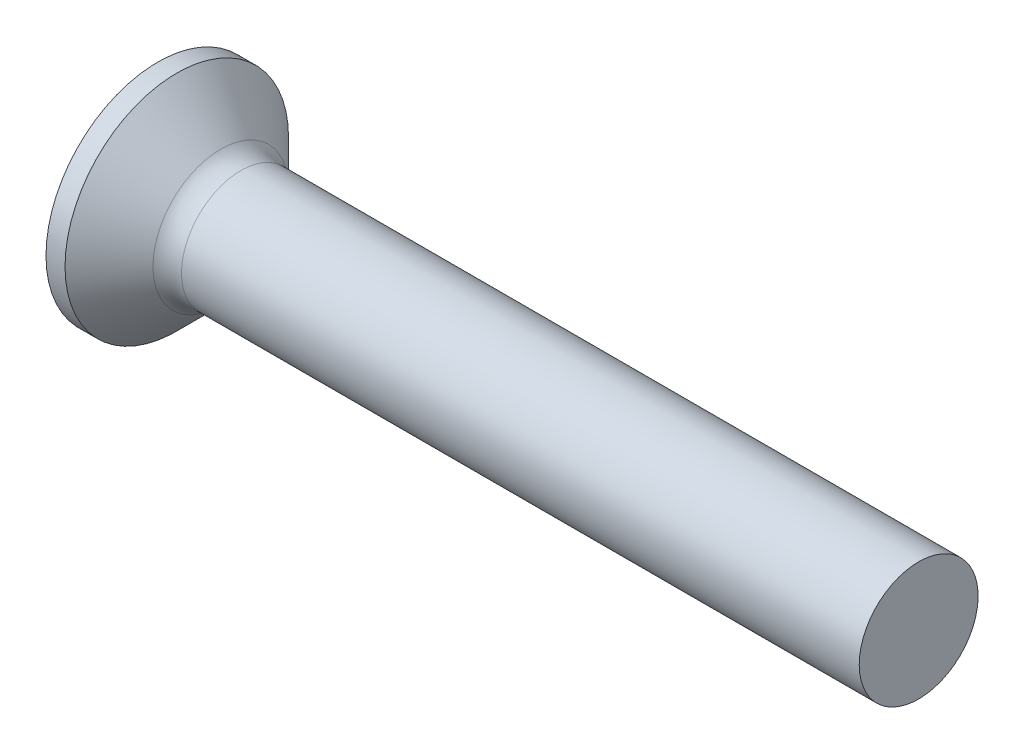
ISO-10303-21;
HEADER;
FILE_DESCRIPTION(('STEP AP214'),'2;1');
FILE_NAME('part.step','',(''),(''),'','','');
FILE_SCHEMA(('AUTOMOTIVE_DESIGN { 1 0 10303 214 1 1 1 1 }'));
ENDSEC;
DATA;
#1=APPLICATION_CONTEXT('core data for automotive mechanical design processes');
#2=APPLICATION_PROTOCOL_DEFINITION('international standard','automotive_design',2000,#1);
#3=PRODUCT_CONTEXT('',#1,'mechanical');
#4=PRODUCT('Part','Part','',(#3));
#5=PRODUCT_RELATED_PRODUCT_CATEGORY('part','',(#4));
#6=PRODUCT_DEFINITION_FORMATION('','',#4);
#7=PRODUCT_DEFINITION_CONTEXT('part definition',#1,'design');
#8=PRODUCT_DEFINITION('design','',#6,#7);
#9=PRODUCT_DEFINITION_SHAPE('','',#8);
#10=(LENGTH_UNIT() NAMED_UNIT(*) SI_UNIT(.MILLI.,.METRE.));
#11=(NAMED_UNIT(*) PLANE_ANGLE_UNIT() SI_UNIT($,.RADIAN.));
#12=(NAMED_UNIT(*) SI_UNIT($,.STERADIAN.) SOLID_ANGLE_UNIT());
#13=UNCERTAINTY_MEASURE_WITH_UNIT(LENGTH_MEASURE(1.E-05),#10,'distance_accuracy_value','');
#14=(GEOMETRIC_REPRESENTATION_CONTEXT(3) GLOBAL_UNCERTAINTY_ASSIGNED_CONTEXT((#13)) GLOBAL_UNIT_ASSIGNED_CONTEXT((#10,
#11,#12)) REPRESENTATION_CONTEXT('',''));
#15=CARTESIAN_POINT('',(0.,0.,0.));
#16=DIRECTION('',(0.,0.,1.));
#17=DIRECTION('',(1.,0.,0.));
#18=AXIS2_PLACEMENT_3D('',#15,#16,#17);
#19=CARTESIAN_POINT('',(1.73,-0.537453962312429,0.37));
#20=DIRECTION('',(0.,0.,-1.));
#21=DIRECTION('',(0.,1.,0.));
#22=AXIS2_PLACEMENT_3D('',#19,#20,#21);
#23=PLANE('',#22);
#24=DIRECTION('',(0.,-1.,0.));
#25=VECTOR('',#24,1.);
#26=CARTESIAN_POINT('',(0.,1.4,0.37));
#27=LINE('',#26,#25);
#28=CARTESIAN_POINT('',(0.,-0.566915305439072,0.37));
#29=VERTEX_POINT('',#28);
#30=CARTESIAN_POINT('',(0.,-1.4,0.37));
#31=VERTEX_POINT('',#30);
#32=EDGE_CURVE('E458',#29,#31,#27,.T.);
#33=ORIENTED_EDGE('',*,*,#32,.F.);
#34=CARTESIAN_POINT('',(-1.01454775314832,-0.649985037380819,0.37));
#35=CARTESIAN_POINT('',(-0.809029839965787,-0.633442085917927,0.37));
#36=CARTESIAN_POINT('',(-0.603523080210379,-0.616757766930615,0.37));
#37=CARTESIAN_POINT('',(-0.192537417897885,-0.582995575513896,0.37));
#38=CARTESIAN_POINT('',(0.0129414839545158,-0.565917694515791,0.37));
#39=CARTESIAN_POINT('',(0.423856873460109,-0.531258276152526,0.37));
#40=CARTESIAN_POINT('',(0.629293361123234,-0.513676738905451,0.37));
#41=CARTESIAN_POINT('',(1.04010430555808,-0.47783288645791,0.37));
#42=CARTESIAN_POINT('',(1.24547876317318,-0.459570580976025,0.37));
#43=CARTESIAN_POINT('',(1.58556056775259,-0.428522827244021,0.37));
#44=CARTESIAN_POINT('',(1.72029296523314,-0.416012545973762,0.37));
#45=CARTESIAN_POINT('',(1.9897048174303,-0.390443058456943,0.37));
#46=CARTESIAN_POINT('',(2.12438427249693,-0.377383855903361,0.37));
#47=CARTESIAN_POINT('',(2.39367840755768,-0.350538593352539,0.37));
#48=CARTESIAN_POINT('',(2.52829308400572,-0.336752497317635,0.37));
#49=CARTESIAN_POINT('',(2.79740865487838,-0.308085247406428,0.37));
#50=CARTESIAN_POINT('',(2.93190954639911,-0.293204066387502,0.37));
#51=CARTESIAN_POINT('',(3.06632904696708,-0.277591273791154,0.37));
#52=B_SPLINE_CURVE_WITH_KNOTS('',3,(#34,#35,#36,#37,#38,#39,#40,#41,#42,#43,#44,#45,#46,#47,#48,
#49,#50,#51),.UNSPECIFIED.,.F.,.F.,(4,2,2,2,2,2,2,2,4),(0.,0.618548221151345,1.23710992218588,
1.85567147819535,2.47422420705856,2.88015918383618,3.28609143004275,3.69204382037103,
4.09800627596968),.UNSPECIFIED.);
#53=CARTESIAN_POINT('',(1.73,-0.415013252800436,0.370000000000001));
#54=VERTEX_POINT('',#53);
#55=EDGE_CURVE('E214',#29,#54,#52,.T.);
#56=ORIENTED_EDGE('',*,*,#55,.T.);
#57=DIRECTION('',(0.,-1.,0.));
#58=VECTOR('',#57,1.);
#59=CARTESIAN_POINT('',(1.73,0.537453962312429,0.37));
#60=LINE('',#59,#58);
#61=CARTESIAN_POINT('',(1.73,-0.537453962312429,0.37));
#62=VERTEX_POINT('',#61);
#63=EDGE_CURVE('E367',#54,#62,#60,.T.);
#64=ORIENTED_EDGE('',*,*,#63,.T.);
#65=DIRECTION('',(0.894934391398442,0.446197753347436,0.));
#66=VECTOR('',#65,1.);
#67=CARTESIAN_POINT('',(0.,-1.4,0.37));
#68=LINE('',#67,#66);
#69=EDGE_CURVE('E466',#31,#62,#68,.T.);
#70=ORIENTED_EDGE('',*,*,#69,.F.);
#71=EDGE_LOOP('',(#33,#56,#64,#70));
#72=FACE_BOUND('',#71,.T.);
#73=ADVANCED_FACE('F35',(#72),#23,.T.);
#74=CARTESIAN_POINT('',(1.73,0.537453962312429,0.37));
#75=VERTEX_POINT('',#74);
#76=CARTESIAN_POINT('',(1.73,0.415013252800436,0.370000000000001));
#77=VERTEX_POINT('',#76);
#78=EDGE_CURVE('E363',#75,#77,#60,.T.);
#79=ORIENTED_EDGE('',*,*,#78,.T.);
#80=CARTESIAN_POINT('',(-1.01454775314832,0.649985037380819,0.37));
#81=CARTESIAN_POINT('',(-0.809029839965787,0.633442085917927,0.37));
#82=CARTESIAN_POINT('',(-0.603523080210379,0.616757766930615,0.37));
#83=CARTESIAN_POINT('',(-0.192537417897885,0.582995575513896,0.37));
#84=CARTESIAN_POINT('',(0.0129414839545158,0.565917694515791,0.37));
#85=CARTESIAN_POINT('',(0.423856873460109,0.531258276152526,0.37));
#86=CARTESIAN_POINT('',(0.629293361123234,0.513676738905451,0.37));
#87=CARTESIAN_POINT('',(1.04010430555808,0.47783288645791,0.37));
#88=CARTESIAN_POINT('',(1.24547876317318,0.459570580976025,0.37));
#89=CARTESIAN_POINT('',(1.58556056775259,0.428522827244021,0.37));
#90=CARTESIAN_POINT('',(1.72029296523314,0.416012545973762,0.37));
#91=CARTESIAN_POINT('',(1.9897048174303,0.390443058456943,0.37));
#92=CARTESIAN_POINT('',(2.12438427249693,0.377383855903361,0.37));
#93=CARTESIAN_POINT('',(2.39367840755768,0.350538593352539,0.37));
#94=CARTESIAN_POINT('',(2.52829308400572,0.336752497317635,0.37));
#95=CARTESIAN_POINT('',(2.79740865487838,0.308085247406428,0.37));
#96=CARTESIAN_POINT('',(2.93190954639911,0.293204066387502,0.37));
#97=CARTESIAN_POINT('',(3.06632904696708,0.277591273791154,0.37));
#98=B_SPLINE_CURVE_WITH_KNOTS('',3,(#80,#81,#82,#83,#84,#85,#86,#87,#88,#89,#90,#91,#92,#93,#94,
#95,#96,#97),.UNSPECIFIED.,.F.,.F.,(4,2,2,2,2,2,2,2,4),(0.,0.618548221151345,1.23710992218588,
1.85567147819535,2.47422420705856,2.88015918383618,3.28609143004275,3.69204382037103,
4.09800627596968),.UNSPECIFIED.);
#99=CARTESIAN_POINT('',(0.,0.566915305439072,0.37));
#100=VERTEX_POINT('',#99);
#101=EDGE_CURVE('E207',#77,#100,#98,.F.);
#102=ORIENTED_EDGE('',*,*,#101,.T.);
#103=CARTESIAN_POINT('',(0.,1.4,0.37));
#104=VERTEX_POINT('',#103);
#105=EDGE_CURVE('E460',#104,#100,#27,.T.);
#106=ORIENTED_EDGE('',*,*,#105,.F.);
#107=DIRECTION('',(0.894934391398443,-0.446197753347436,0.));
#108=VECTOR('',#107,1.);
#109=CARTESIAN_POINT('',(0.,1.4,0.37));
#110=LINE('',#109,#108);
#111=EDGE_CURVE('E58',#104,#75,#110,.T.);
#112=ORIENTED_EDGE('',*,*,#111,.T.);
#113=EDGE_LOOP('',(#79,#102,#106,#112));
#114=FACE_BOUND('',#113,.T.);
#115=ADVANCED_FACE('F189',(#114),#23,.T.);
#116=CARTESIAN_POINT('',(1.73,0.53745396231243,-0.37));
#117=DIRECTION('',(0.,0.,1.));
#118=DIRECTION('',(1.,0.,0.));
#119=AXIS2_PLACEMENT_3D('',#116,#117,#118);
#120=PLANE('',#119);
#121=DIRECTION('',(0.,1.,0.));
#122=VECTOR('',#121,1.);
#123=CARTESIAN_POINT('',(1.73,-0.537453962312429,-0.37));
#124=LINE('',#123,#122);
#125=CARTESIAN_POINT('',(1.73,-0.537453962312429,-0.37));
#126=VERTEX_POINT('',#125);
#127=CARTESIAN_POINT('',(1.73,-0.415013252800436,-0.370000000000001));
#128=VERTEX_POINT('',#127);
#129=EDGE_CURVE('E376',#126,#128,#124,.T.);
#130=ORIENTED_EDGE('',*,*,#129,.T.);
#131=CARTESIAN_POINT('',(-1.01454775316786,-0.649985037382392,-0.37));
#132=CARTESIAN_POINT('',(-0.809029839983234,-0.63344208591934,-0.37));
#133=CARTESIAN_POINT('',(-0.603523080225735,-0.616757766931868,-0.37));
#134=CARTESIAN_POINT('',(-0.192537417909059,-0.582995575514823,-0.37));
#135=CARTESIAN_POINT('',(0.0129414839454313,-0.565917694516552,-0.37));
#136=CARTESIAN_POINT('',(0.4238568734577,-0.531258276152735,-0.37));
#137=CARTESIAN_POINT('',(0.62929336112541,-0.513676738905269,-0.37));
#138=CARTESIAN_POINT('',(1.04010430556943,-0.477832886456913,-0.37));
#139=CARTESIAN_POINT('',(1.2454787631891,-0.459570580974604,-0.37));
#140=CARTESIAN_POINT('',(1.58556056777309,-0.428522827242128,-0.37));
#141=CARTESIAN_POINT('',(1.72029296525365,-0.416012545971845,-0.37));
#142=CARTESIAN_POINT('',(1.9897048174508,-0.39044305845497,-0.37));
#143=CARTESIAN_POINT('',(2.12438427251743,-0.377383855901355,-0.37));
#144=CARTESIAN_POINT('',(2.39367840757817,-0.350538593350458,-0.37));
#145=CARTESIAN_POINT('',(2.52829308402621,-0.33675249731551,-0.37));
#146=CARTESIAN_POINT('',(2.79740865489886,-0.308085247404194,-0.37));
#147=CARTESIAN_POINT('',(2.93190954641958,-0.293204066385202,-0.37));
#148=CARTESIAN_POINT('',(3.06632904698754,-0.27759127378877,-0.37));
#149=B_SPLINE_CURVE_WITH_KNOTS('',3,(#131,#132,#133,#134,#135,#136,#137,#138,#139,#140,#141,
#142,#143,#144,#145,#146,#147,#148),.UNSPECIFIED.,.F.,.F.,(4,2,2,2,2,2,2,2,4),(0.,
0.618548221157635,1.23710992219846,1.85567147822173,2.47422420709875,2.88015918387637,
3.28609143008294,3.69204382041122,4.09800627600988),.UNSPECIFIED.);
#150=CARTESIAN_POINT('',(0.,-0.566915305439072,-0.37));
#151=VERTEX_POINT('',#150);
#152=EDGE_CURVE('E270',#128,#151,#149,.F.);
#153=ORIENTED_EDGE('',*,*,#152,.T.);
#154=DIRECTION('',(0.,1.,0.));
#155=VECTOR('',#154,1.);
#156=CARTESIAN_POINT('',(0.,-1.4,-0.37));
#157=LINE('',#156,#155);
#158=CARTESIAN_POINT('',(0.,-1.4,-0.37));
#159=VERTEX_POINT('',#158);
#160=EDGE_CURVE('E459',#159,#151,#157,.T.);
#161=ORIENTED_EDGE('',*,*,#160,.F.);
#162=DIRECTION('',(0.894934391398442,0.446197753347436,0.));
#163=VECTOR('',#162,1.);
#164=CARTESIAN_POINT('',(0.,-1.4,-0.37));
#165=LINE('',#164,#163);
#166=EDGE_CURVE('E469',#159,#126,#165,.T.);
#167=ORIENTED_EDGE('',*,*,#166,.T.);
#168=EDGE_LOOP('',(#130,#153,#161,#167));
#169=FACE_BOUND('',#168,.T.);
#170=ADVANCED_FACE('F195',(#169),#120,.T.);
#171=CARTESIAN_POINT('',(0.,0.566915305439072,-0.37));
#172=VERTEX_POINT('',#171);
#173=CARTESIAN_POINT('',(0.,1.4,-0.37));
#174=VERTEX_POINT('',#173);
#175=EDGE_CURVE('E465',#172,#174,#157,.T.);
#176=ORIENTED_EDGE('',*,*,#175,.F.);
#177=CARTESIAN_POINT('',(-1.01454775316786,0.649985037382392,-0.37));
#178=CARTESIAN_POINT('',(-0.809029839983234,0.63344208591934,-0.37));
#179=CARTESIAN_POINT('',(-0.603523080225735,0.616757766931868,-0.37));
#180=CARTESIAN_POINT('',(-0.192537417909059,0.582995575514823,-0.37));
#181=CARTESIAN_POINT('',(0.0129414839454314,0.565917694516552,-0.37));
#182=CARTESIAN_POINT('',(0.4238568734577,0.531258276152735,-0.37));
#183=CARTESIAN_POINT('',(0.62929336112541,0.513676738905269,-0.37));
#184=CARTESIAN_POINT('',(1.04010430556943,0.477832886456913,-0.37));
#185=CARTESIAN_POINT('',(1.2454787631891,0.459570580974604,-0.37));
#186=CARTESIAN_POINT('',(1.58556056777309,0.428522827242128,-0.37));
#187=CARTESIAN_POINT('',(1.72029296525364,0.416012545971845,-0.37));
#188=CARTESIAN_POINT('',(1.9897048174508,0.39044305845497,-0.37));
#189=CARTESIAN_POINT('',(2.12438427251743,0.377383855901355,-0.37));
#190=CARTESIAN_POINT('',(2.39367840757817,0.350538593350458,-0.37));
#191=CARTESIAN_POINT('',(2.5282930840262,0.33675249731551,-0.37));
#192=CARTESIAN_POINT('',(2.79740865489886,0.308085247404194,-0.37));
#193=CARTESIAN_POINT('',(2.93190954641958,0.293204066385202,-0.37));
#194=CARTESIAN_POINT('',(3.06632904698754,0.27759127378877,-0.37));
#195=B_SPLINE_CURVE_WITH_KNOTS('',3,(#177,#178,#179,#180,#181,#182,#183,#184,#185,#186,#187,
#188,#189,#190,#191,#192,#193,#194),.UNSPECIFIED.,.F.,.F.,(4,2,2,2,2,2,2,2,4),(0.,
0.618548221157635,1.23710992219846,1.85567147822173,2.47422420709875,2.88015918387637,
3.28609143008294,3.69204382041122,4.09800627600988),.UNSPECIFIED.);
#196=CARTESIAN_POINT('',(1.73,0.415013252800436,-0.370000000000001));
#197=VERTEX_POINT('',#196);
#198=EDGE_CURVE('E264',#172,#197,#195,.T.);
#199=ORIENTED_EDGE('',*,*,#198,.T.);
#200=CARTESIAN_POINT('',(1.73,0.53745396231243,-0.37));
#201=VERTEX_POINT('',#200);
#202=EDGE_CURVE('E378',#197,#201,#124,.T.);
#203=ORIENTED_EDGE('',*,*,#202,.T.);
#204=DIRECTION('',(0.894934391398443,-0.446197753347436,0.));
#205=VECTOR('',#204,1.);
#206=CARTESIAN_POINT('',(0.,1.4,-0.37));
#207=LINE('',#206,#205);
#208=EDGE_CURVE('E375',#174,#201,#207,.T.);
#209=ORIENTED_EDGE('',*,*,#208,.F.);
#210=EDGE_LOOP('',(#176,#199,#203,#209));
#211=FACE_BOUND('',#210,.T.);
#212=ADVANCED_FACE('F476',(#211),#120,.T.);
#213=CARTESIAN_POINT('',(1.73,0.537453962312429,-0.37));
#214=DIRECTION('',(1.,0.,0.));
#215=DIRECTION('',(0.,0.,-1.));
#216=AXIS2_PLACEMENT_3D('',#213,#214,#215);
#217=PLANE('',#216);
#218=CARTESIAN_POINT('',(1.73,0.,0.));
#219=DIRECTION('',(-1.,0.,0.));
#220=DIRECTION('',(0.,0.,1.));
#221=AXIS2_PLACEMENT_3D('',#218,#219,#220);
#222=CIRCLE('',#221,0.555999999999999);
#223=CARTESIAN_POINT('',(1.73,-0.142405190897905,-0.53745396231243));
#224=VERTEX_POINT('',#223);
#225=CARTESIAN_POINT('',(1.73,-0.369999999999999,-0.415013252800438));
#226=VERTEX_POINT('',#225);
#227=EDGE_CURVE('E342',#224,#226,#222,.T.);
#228=ORIENTED_EDGE('',*,*,#227,.F.);
#229=DIRECTION('',(0.,1.,0.));
#230=VECTOR('',#229,1.);
#231=CARTESIAN_POINT('',(1.73,-0.369999999999998,-0.53745396231243));
#232=LINE('',#231,#230);
#233=CARTESIAN_POINT('',(1.73,-0.369999999999998,-0.53745396231243));
#234=VERTEX_POINT('',#233);
#235=EDGE_CURVE('E443',#234,#224,#232,.T.);
#236=ORIENTED_EDGE('',*,*,#235,.F.);
#237=DIRECTION('',(0.,0.,-1.));
#238=VECTOR('',#237,1.);
#239=CARTESIAN_POINT('',(1.73,-0.370000000000002,0.537453962312428));
#240=LINE('',#239,#238);
#241=EDGE_CURVE('E447',#226,#234,#240,.T.);
#242=ORIENTED_EDGE('',*,*,#241,.F.);
#243=EDGE_LOOP('',(#228,#236,#242));
#244=FACE_BOUND('',#243,.T.);
#245=ADVANCED_FACE('F489',(#244),#217,.F.);
#246=CARTESIAN_POINT('',(1.73,-0.537453962312429,-0.142405190897907));
#247=VERTEX_POINT('',#246);
#248=EDGE_CURVE('E337',#128,#247,#222,.T.);
#249=ORIENTED_EDGE('',*,*,#248,.F.);
#250=ORIENTED_EDGE('',*,*,#129,.F.);
#251=DIRECTION('',(0.,0.,-1.));
#252=VECTOR('',#251,1.);
#253=CARTESIAN_POINT('',(1.73,-0.537453962312429,0.37));
#254=LINE('',#253,#252);
#255=EDGE_CURVE('E366',#247,#126,#254,.T.);
#256=ORIENTED_EDGE('',*,*,#255,.F.);
#257=EDGE_LOOP('',(#249,#250,#256));
#258=FACE_BOUND('',#257,.T.);
#259=ADVANCED_FACE('F495',(#258),#217,.F.);
#260=CARTESIAN_POINT('',(1.73,-0.537453962312429,0.142405190897907));
#261=VERTEX_POINT('',#260);
#262=EDGE_CURVE('E332',#261,#54,#222,.T.);
#263=ORIENTED_EDGE('',*,*,#262,.F.);
#264=EDGE_CURVE('E369',#62,#261,#254,.T.);
#265=ORIENTED_EDGE('',*,*,#264,.F.);
#266=ORIENTED_EDGE('',*,*,#63,.F.);
#267=EDGE_LOOP('',(#263,#265,#266));
#268=FACE_BOUND('',#267,.T.);
#269=ADVANCED_FACE('F501',(#268),#217,.F.);
#270=CARTESIAN_POINT('',(1.73,-0.370000000000001,0.415013252800436));
#271=VERTEX_POINT('',#270);
#272=CARTESIAN_POINT('',(1.73,-0.142405190897905,0.537453962312429));
#273=VERTEX_POINT('',#272);
#274=EDGE_CURVE('E50',#271,#273,#222,.T.);
#275=ORIENTED_EDGE('',*,*,#274,.F.);
#276=CARTESIAN_POINT('',(1.73,-0.370000000000002,0.537453962312428));
#277=VERTEX_POINT('',#276);
#278=EDGE_CURVE('E449',#277,#271,#240,.T.);
#279=ORIENTED_EDGE('',*,*,#278,.F.);
#280=DIRECTION('',(0.,-1.,0.));
#281=VECTOR('',#280,1.);
#282=CARTESIAN_POINT('',(1.73,0.369999999999998,0.537453962312431));
#283=LINE('',#282,#281);
#284=EDGE_CURVE('E448',#273,#277,#283,.T.);
#285=ORIENTED_EDGE('',*,*,#284,.F.);
#286=EDGE_LOOP('',(#275,#279,#285));
#287=FACE_BOUND('',#286,.T.);
#288=ADVANCED_FACE('F528',(#287),#217,.F.);
#289=CARTESIAN_POINT('',(1.73,0.142405190897904,0.53745396231243));
#290=VERTEX_POINT('',#289);
#291=CARTESIAN_POINT('',(1.73,0.369999999999999,0.415013252800438));
#292=VERTEX_POINT('',#291);
#293=EDGE_CURVE('E323',#290,#292,#222,.T.);
#294=ORIENTED_EDGE('',*,*,#293,.F.);
#295=CARTESIAN_POINT('',(1.73,0.369999999999998,0.537453962312431));
#296=VERTEX_POINT('',#295);
#297=EDGE_CURVE('E444',#296,#290,#283,.T.);
#298=ORIENTED_EDGE('',*,*,#297,.F.);
#299=DIRECTION('',(0.,0.,1.));
#300=VECTOR('',#299,1.);
#301=CARTESIAN_POINT('',(1.73,0.370000000000002,-0.537453962312428));
#302=LINE('',#301,#300);
#303=EDGE_CURVE('E221',#292,#296,#302,.T.);
#304=ORIENTED_EDGE('',*,*,#303,.F.);
#305=EDGE_LOOP('',(#294,#298,#304));
#306=FACE_BOUND('',#305,.T.);
#307=ADVANCED_FACE('F485',(#306),#217,.F.);
#308=CARTESIAN_POINT('',(1.73,0.537453962312429,0.142405190897906));
#309=VERTEX_POINT('',#308);
#310=EDGE_CURVE('E330',#77,#309,#222,.T.);
#311=ORIENTED_EDGE('',*,*,#310,.F.);
#312=ORIENTED_EDGE('',*,*,#78,.F.);
#313=DIRECTION('',(0.,0.,1.));
#314=VECTOR('',#313,1.);
#315=CARTESIAN_POINT('',(1.73,0.537453962312429,-0.37));
#316=LINE('',#315,#314);
#317=EDGE_CURVE('E364',#309,#75,#316,.T.);
#318=ORIENTED_EDGE('',*,*,#317,.F.);
#319=EDGE_LOOP('',(#311,#312,#318));
#320=FACE_BOUND('',#319,.T.);
#321=ADVANCED_FACE('F362',(#320),#217,.F.);
#322=CARTESIAN_POINT('',(1.73,0.537453962312429,-0.142405190897906));
#323=VERTEX_POINT('',#322);
#324=EDGE_CURVE('E352',#323,#197,#222,.T.);
#325=ORIENTED_EDGE('',*,*,#324,.F.);
#326=EDGE_CURVE('E371',#201,#323,#316,.T.);
#327=ORIENTED_EDGE('',*,*,#326,.F.);
#328=ORIENTED_EDGE('',*,*,#202,.F.);
#329=EDGE_LOOP('',(#325,#327,#328));
#330=FACE_BOUND('',#329,.T.);
#331=ADVANCED_FACE('F478',(#330),#217,.F.);
#332=CARTESIAN_POINT('',(1.73,-0.537453962312429,-0.37));
#333=DIRECTION('',(-0.446197753347436,0.894934391398443,0.));
#334=DIRECTION('',(-0.894934391398442,-0.446197753347436,0.));
#335=AXIS2_PLACEMENT_3D('',#332,#333,#334);
#336=PLANE('',#335);
#337=ORIENTED_EDGE('',*,*,#264,.T.);
#338=CARTESIAN_POINT('',(2.6700539918433,-0.068760409782475,0.));
#339=DIRECTION('',(-0.446197753347436,0.894934391398443,0.));
#340=DIRECTION('',(-0.894934391398443,-0.446197753347436,0.));
#341=AXIS2_PLACEMENT_3D('',#338,#339,#340);
#342=ELLIPSE('',#341,1.09876174323515,0.485419197346535);
#343=EDGE_CURVE('E282',#261,#247,#342,.F.);
#344=ORIENTED_EDGE('',*,*,#343,.T.);
#345=ORIENTED_EDGE('',*,*,#255,.T.);
#346=ORIENTED_EDGE('',*,*,#166,.F.);
#347=DIRECTION('',(0.,0.,-1.));
#348=VECTOR('',#347,1.);
#349=CARTESIAN_POINT('',(0.,-1.4,0.37));
#350=LINE('',#349,#348);
#351=EDGE_CURVE('E383',#31,#159,#350,.T.);
#352=ORIENTED_EDGE('',*,*,#351,.F.);
#353=ORIENTED_EDGE('',*,*,#69,.T.);
#354=EDGE_LOOP('',(#337,#344,#345,#346,#352,#353));
#355=FACE_BOUND('',#354,.T.);
#356=ADVANCED_FACE('F201',(#355),#336,.T.);
#357=CARTESIAN_POINT('',(0.,1.4,0.37));
#358=DIRECTION('',(-0.446197753347436,-0.894934391398443,0.));
#359=DIRECTION('',(0.894934391398443,-0.446197753347436,0.));
#360=AXIS2_PLACEMENT_3D('',#357,#358,#359);
#361=PLANE('',#360);
#362=ORIENTED_EDGE('',*,*,#326,.T.);
#363=CARTESIAN_POINT('',(2.6700539918433,0.0687604097824753,0.));
#364=DIRECTION('',(-0.446197753347436,-0.894934391398443,0.));
#365=DIRECTION('',(-0.894934391398443,0.446197753347436,0.));
#366=AXIS2_PLACEMENT_3D('',#363,#364,#365);
#367=ELLIPSE('',#366,1.09876174323515,0.485419197346535);
#368=EDGE_CURVE('E287',#323,#309,#367,.F.);
#369=ORIENTED_EDGE('',*,*,#368,.T.);
#370=ORIENTED_EDGE('',*,*,#317,.T.);
#371=ORIENTED_EDGE('',*,*,#111,.F.);
#372=DIRECTION('',(0.,0.,1.));
#373=VECTOR('',#372,1.);
#374=CARTESIAN_POINT('',(0.,1.4,-0.37));
#375=LINE('',#374,#373);
#376=EDGE_CURVE('E455',#174,#104,#375,.T.);
#377=ORIENTED_EDGE('',*,*,#376,.F.);
#378=ORIENTED_EDGE('',*,*,#208,.T.);
#379=EDGE_LOOP('',(#362,#369,#370,#371,#377,#378));
#380=FACE_BOUND('',#379,.T.);
#381=ADVANCED_FACE('F474',(#380),#361,.T.);
#382=CARTESIAN_POINT('',(1.73,0.369999999999998,0.537453962312431));
#383=DIRECTION('',(0.,-1.,0.));
#384=DIRECTION('',(1.,0.,0.));
#385=AXIS2_PLACEMENT_3D('',#382,#383,#384);
#386=PLANE('',#385);
#387=CARTESIAN_POINT('',(1.73,0.370000000000002,-0.537453962312428));
#388=VERTEX_POINT('',#387);
#389=CARTESIAN_POINT('',(1.73,0.370000000000001,-0.415013252800436));
#390=VERTEX_POINT('',#389);
#391=EDGE_CURVE('E453',#388,#390,#302,.T.);
#392=ORIENTED_EDGE('',*,*,#391,.T.);
#393=CARTESIAN_POINT('',(-1.01454775314832,0.370000000000002,-0.649985037380818));
#394=CARTESIAN_POINT('',(-0.809029839965788,0.370000000000002,-0.633442085917926));
#395=CARTESIAN_POINT('',(-0.60352308021038,0.370000000000002,-0.616757766930614));
#396=CARTESIAN_POINT('',(-0.192537417897885,0.370000000000002,-0.582995575513895));
#397=CARTESIAN_POINT('',(0.0129414839545158,0.370000000000002,-0.56591769451579));
#398=CARTESIAN_POINT('',(0.423856873460108,0.370000000000002,-0.531258276152525));
#399=CARTESIAN_POINT('',(0.629293361123234,0.370000000000002,-0.51367673890545));
#400=CARTESIAN_POINT('',(1.04010430555808,0.370000000000001,-0.477832886457909));
#401=CARTESIAN_POINT('',(1.24547876317318,0.370000000000001,-0.459570580976024));
#402=CARTESIAN_POINT('',(1.58556056775259,0.370000000000001,-0.42852282724402));
#403=CARTESIAN_POINT('',(1.72029296523314,0.370000000000001,-0.416012545973761));
#404=CARTESIAN_POINT('',(1.9897048174303,0.370000000000001,-0.390443058456942));
#405=CARTESIAN_POINT('',(2.12438427249693,0.370000000000001,-0.377383855903359));
#406=CARTESIAN_POINT('',(2.39367840755768,0.370000000000001,-0.350538593352537));
#407=CARTESIAN_POINT('',(2.52829308400572,0.370000000000001,-0.336752497317634));
#408=CARTESIAN_POINT('',(2.79740865487838,0.370000000000001,-0.308085247406427));
#409=CARTESIAN_POINT('',(2.93190954639911,0.370000000000001,-0.293204066387501));
#410=CARTESIAN_POINT('',(3.06632904696708,0.370000000000001,-0.277591273791153));
#411=B_SPLINE_CURVE_WITH_KNOTS('',3,(#393,#394,#395,#396,#397,#398,#399,#400,#401,#402,#403,
#404,#405,#406,#407,#408,#409,#410),.UNSPECIFIED.,.F.,.F.,(4,2,2,2,2,2,2,2,4),(0.,
0.618548221151345,1.23710992218588,1.85567147819535,2.47422420705856,2.88015918383618,
3.28609143004275,3.69204382037103,4.09800627596968),.UNSPECIFIED.);
#412=CARTESIAN_POINT('',(0.,0.370000000000002,-0.566915305439071));
#413=VERTEX_POINT('',#412);
#414=EDGE_CURVE('E256',#390,#413,#411,.F.);
#415=ORIENTED_EDGE('',*,*,#414,.T.);
#416=DIRECTION('',(0.,0.,1.));
#417=VECTOR('',#416,1.);
#418=CARTESIAN_POINT('',(0.,0.370000000000005,-1.4));
#419=LINE('',#418,#417);
#420=CARTESIAN_POINT('',(0.,0.370000000000005,-1.4));
#421=VERTEX_POINT('',#420);
#422=EDGE_CURVE('E429',#421,#413,#419,.T.);
#423=ORIENTED_EDGE('',*,*,#422,.F.);
#424=DIRECTION('',(0.894934391398442,0.,0.446197753347436));
#425=VECTOR('',#424,1.);
#426=CARTESIAN_POINT('',(0.,0.370000000000005,-1.4));
#427=LINE('',#426,#425);
#428=EDGE_CURVE('E435',#421,#388,#427,.T.);
#429=ORIENTED_EDGE('',*,*,#428,.T.);
#430=EDGE_LOOP('',(#392,#415,#423,#429));
#431=FACE_BOUND('',#430,.T.);
#432=ADVANCED_FACE('F608',(#431),#386,.T.);
#433=CARTESIAN_POINT('',(1.73,-0.369999999999998,-0.53745396231243));
#434=DIRECTION('',(0.,1.,0.));
#435=DIRECTION('',(0.,0.,1.));
#436=AXIS2_PLACEMENT_3D('',#433,#434,#435);
#437=PLANE('',#436);
#438=DIRECTION('',(0.,0.,-1.));
#439=VECTOR('',#438,1.);
#440=CARTESIAN_POINT('',(0.,-0.370000000000005,1.4));
#441=LINE('',#440,#439);
#442=CARTESIAN_POINT('',(0.,-0.369999999999998,-0.566915305439073));
#443=VERTEX_POINT('',#442);
#444=CARTESIAN_POINT('',(0.,-0.369999999999995,-1.4));
#445=VERTEX_POINT('',#444);
#446=EDGE_CURVE('E425',#443,#445,#441,.T.);
#447=ORIENTED_EDGE('',*,*,#446,.F.);
#448=CARTESIAN_POINT('',(-1.01454775316786,-0.369999999999998,-0.649985037382392));
#449=CARTESIAN_POINT('',(-0.809029839983234,-0.369999999999998,-0.633442085919341));
#450=CARTESIAN_POINT('',(-0.603523080225735,-0.369999999999998,-0.616757766931869));
#451=CARTESIAN_POINT('',(-0.192537417909059,-0.369999999999998,-0.582995575514824));
#452=CARTESIAN_POINT('',(0.0129414839454314,-0.369999999999998,-0.565917694516553));
#453=CARTESIAN_POINT('',(0.4238568734577,-0.369999999999998,-0.531258276152736));
#454=CARTESIAN_POINT('',(0.62929336112541,-0.369999999999998,-0.51367673890527));
#455=CARTESIAN_POINT('',(1.04010430556943,-0.369999999999998,-0.477832886456914));
#456=CARTESIAN_POINT('',(1.2454787631891,-0.369999999999998,-0.459570580974605));
#457=CARTESIAN_POINT('',(1.58556056777309,-0.369999999999999,-0.428522827242129));
#458=CARTESIAN_POINT('',(1.72029296525365,-0.369999999999999,-0.416012545971846));
#459=CARTESIAN_POINT('',(1.9897048174508,-0.369999999999999,-0.390443058454971));
#460=CARTESIAN_POINT('',(2.12438427251743,-0.369999999999999,-0.377383855901356));
#461=CARTESIAN_POINT('',(2.39367840757817,-0.369999999999999,-0.350538593350459));
#462=CARTESIAN_POINT('',(2.52829308402621,-0.369999999999999,-0.336752497315511));
#463=CARTESIAN_POINT('',(2.79740865489886,-0.369999999999999,-0.308085247404195));
#464=CARTESIAN_POINT('',(2.93190954641958,-0.369999999999999,-0.293204066385203));
#465=CARTESIAN_POINT('',(3.06632904698754,-0.369999999999999,-0.277591273788772));
#466=B_SPLINE_CURVE_WITH_KNOTS('',3,(#448,#449,#450,#451,#452,#453,#454,#455,#456,#457,#458,
#459,#460,#461,#462,#463,#464,#465),.UNSPECIFIED.,.F.,.F.,(4,2,2,2,2,2,2,2,4),(0.,
0.618548221157635,1.23710992219846,1.85567147822173,2.47422420709875,2.88015918387637,
3.28609143008294,3.69204382041122,4.09800627600988),.UNSPECIFIED.);
#467=EDGE_CURVE('E249',#443,#226,#466,.T.);
#468=ORIENTED_EDGE('',*,*,#467,.T.);
#469=ORIENTED_EDGE('',*,*,#241,.T.);
#470=DIRECTION('',(0.894934391398442,0.,0.446197753347436));
#471=VECTOR('',#470,1.);
#472=CARTESIAN_POINT('',(0.,-0.369999999999995,-1.4));
#473=LINE('',#472,#471);
#474=EDGE_CURVE('E432',#445,#234,#473,.T.);
#475=ORIENTED_EDGE('',*,*,#474,.F.);
#476=EDGE_LOOP('',(#447,#468,#469,#475));
#477=FACE_BOUND('',#476,.T.);
#478=ADVANCED_FACE('F506',(#477),#437,.T.);
#479=CARTESIAN_POINT('',(1.73,0.370000000000002,-0.537453962312428));
#480=DIRECTION('',(-0.446197753347436,0.,0.894934391398443));
#481=DIRECTION('',(-0.894934391398442,0.,-0.446197753347436));
#482=AXIS2_PLACEMENT_3D('',#479,#480,#481);
#483=PLANE('',#482);
#484=ORIENTED_EDGE('',*,*,#235,.T.);
#485=CARTESIAN_POINT('',(2.6700539918433,0.,-0.068760409782475));
#486=DIRECTION('',(-0.446197753347436,0.,0.894934391398443));
#487=DIRECTION('',(-0.894934391398443,0.,-0.446197753347436));
#488=AXIS2_PLACEMENT_3D('',#485,#486,#487);
#489=ELLIPSE('',#488,1.09876174323515,0.485419197346535);
#490=CARTESIAN_POINT('',(1.73,0.142405190897909,-0.537453962312429));
#491=VERTEX_POINT('',#490);
#492=EDGE_CURVE('E300',#224,#491,#489,.F.);
#493=ORIENTED_EDGE('',*,*,#492,.T.);
#494=EDGE_CURVE('E451',#491,#388,#232,.T.);
#495=ORIENTED_EDGE('',*,*,#494,.T.);
#496=ORIENTED_EDGE('',*,*,#428,.F.);
#497=DIRECTION('',(0.,1.,0.));
#498=VECTOR('',#497,1.);
#499=CARTESIAN_POINT('',(0.,-0.369999999999995,-1.4));
#500=LINE('',#499,#498);
#501=EDGE_CURVE('E424',#445,#421,#500,.T.);
#502=ORIENTED_EDGE('',*,*,#501,.F.);
#503=ORIENTED_EDGE('',*,*,#474,.T.);
#504=EDGE_LOOP('',(#484,#493,#495,#496,#502,#503));
#505=FACE_BOUND('',#504,.T.);
#506=ADVANCED_FACE('F226',(#505),#483,.T.);
#507=ORIENTED_EDGE('',*,*,#278,.T.);
#508=CARTESIAN_POINT('',(-1.01454775314832,-0.370000000000002,0.649985037380818));
#509=CARTESIAN_POINT('',(-0.809029839965788,-0.370000000000002,0.633442085917926));
#510=CARTESIAN_POINT('',(-0.60352308021038,-0.370000000000002,0.616757766930614));
#511=CARTESIAN_POINT('',(-0.192537417897885,-0.370000000000002,0.582995575513895));
#512=CARTESIAN_POINT('',(0.0129414839545157,-0.370000000000002,0.56591769451579));
#513=CARTESIAN_POINT('',(0.423856873460108,-0.370000000000002,0.531258276152525));
#514=CARTESIAN_POINT('',(0.629293361123234,-0.370000000000002,0.51367673890545));
#515=CARTESIAN_POINT('',(1.04010430555808,-0.370000000000002,0.477832886457909));
#516=CARTESIAN_POINT('',(1.24547876317318,-0.370000000000002,0.459570580976024));
#517=CARTESIAN_POINT('',(1.58556056775259,-0.370000000000001,0.42852282724402));
#518=CARTESIAN_POINT('',(1.72029296523314,-0.370000000000001,0.416012545973761));
#519=CARTESIAN_POINT('',(1.9897048174303,-0.370000000000001,0.390443058456942));
#520=CARTESIAN_POINT('',(2.12438427249693,-0.370000000000001,0.377383855903359));
#521=CARTESIAN_POINT('',(2.39367840755768,-0.370000000000001,0.350538593352538));
#522=CARTESIAN_POINT('',(2.52829308400572,-0.370000000000001,0.336752497317634));
#523=CARTESIAN_POINT('',(2.79740865487838,-0.370000000000001,0.308085247406427));
#524=CARTESIAN_POINT('',(2.93190954639911,-0.370000000000001,0.293204066387501));
#525=CARTESIAN_POINT('',(3.06632904696708,-0.370000000000001,0.277591273791153));
#526=B_SPLINE_CURVE_WITH_KNOTS('',3,(#508,#509,#510,#511,#512,#513,#514,#515,#516,#517,#518,
#519,#520,#521,#522,#523,#524,#525),.UNSPECIFIED.,.F.,.F.,(4,2,2,2,2,2,2,2,4),(0.,
0.618548221151345,1.23710992218588,1.85567147819535,2.47422420705856,2.88015918383618,
3.28609143004275,3.69204382037103,4.09800627596968),.UNSPECIFIED.);
#527=CARTESIAN_POINT('',(0.,-0.370000000000002,0.566915305439071));
#528=VERTEX_POINT('',#527);
#529=EDGE_CURVE('E241',#271,#528,#526,.F.);
#530=ORIENTED_EDGE('',*,*,#529,.T.);
#531=CARTESIAN_POINT('',(0.,-0.370000000000005,1.4));
#532=VERTEX_POINT('',#531);
#533=EDGE_CURVE('E420',#532,#528,#441,.T.);
#534=ORIENTED_EDGE('',*,*,#533,.F.);
#535=DIRECTION('',(0.894934391398443,0.,-0.446197753347436));
#536=VECTOR('',#535,1.);
#537=CARTESIAN_POINT('',(0.,-0.370000000000005,1.4));
#538=LINE('',#537,#536);
#539=EDGE_CURVE('E438',#532,#277,#538,.T.);
#540=ORIENTED_EDGE('',*,*,#539,.T.);
#541=EDGE_LOOP('',(#507,#530,#534,#540));
#542=FACE_BOUND('',#541,.T.);
#543=ADVANCED_FACE('F526',(#542),#437,.T.);
#544=CARTESIAN_POINT('',(0.,0.369999999999998,0.566915305439073));
#545=VERTEX_POINT('',#544);
#546=CARTESIAN_POINT('',(0.,0.369999999999995,1.4));
#547=VERTEX_POINT('',#546);
#548=EDGE_CURVE('E431',#545,#547,#419,.T.);
#549=ORIENTED_EDGE('',*,*,#548,.F.);
#550=CARTESIAN_POINT('',(-1.01454775316786,0.369999999999997,0.649985037382393));
#551=CARTESIAN_POINT('',(-0.809029839983234,0.369999999999997,0.633442085919342));
#552=CARTESIAN_POINT('',(-0.603523080225735,0.369999999999997,0.616757766931869));
#553=CARTESIAN_POINT('',(-0.192537417909059,0.369999999999998,0.582995575514824));
#554=CARTESIAN_POINT('',(0.0129414839454315,0.369999999999998,0.565917694516553));
#555=CARTESIAN_POINT('',(0.4238568734577,0.369999999999998,0.531258276152736));
#556=CARTESIAN_POINT('',(0.62929336112541,0.369999999999998,0.51367673890527));
#557=CARTESIAN_POINT('',(1.04010430556943,0.369999999999998,0.477832886456914));
#558=CARTESIAN_POINT('',(1.2454787631891,0.369999999999998,0.459570580974605));
#559=CARTESIAN_POINT('',(1.58556056777309,0.369999999999998,0.428522827242129));
#560=CARTESIAN_POINT('',(1.72029296525365,0.369999999999999,0.416012545971846));
#561=CARTESIAN_POINT('',(1.9897048174508,0.369999999999999,0.390443058454971));
#562=CARTESIAN_POINT('',(2.12438427251743,0.369999999999999,0.377383855901356));
#563=CARTESIAN_POINT('',(2.39367840757817,0.369999999999999,0.350538593350459));
#564=CARTESIAN_POINT('',(2.52829308402621,0.369999999999999,0.336752497315511));
#565=CARTESIAN_POINT('',(2.79740865489886,0.369999999999999,0.308085247404195));
#566=CARTESIAN_POINT('',(2.93190954641958,0.369999999999999,0.293204066385203));
#567=CARTESIAN_POINT('',(3.06632904698754,0.369999999999999,0.277591273788771));
#568=B_SPLINE_CURVE_WITH_KNOTS('',3,(#550,#551,#552,#553,#554,#555,#556,#557,#558,#559,#560,
#561,#562,#563,#564,#565,#566,#567),.UNSPECIFIED.,.F.,.F.,(4,2,2,2,2,2,2,2,4),(0.,
0.618548221157635,1.23710992219846,1.85567147822173,2.47422420709875,2.88015918387637,
3.28609143008294,3.69204382041122,4.09800627600988),.UNSPECIFIED.);
#569=EDGE_CURVE('E231',#545,#292,#568,.T.);
#570=ORIENTED_EDGE('',*,*,#569,.T.);
#571=ORIENTED_EDGE('',*,*,#303,.T.);
#572=DIRECTION('',(0.894934391398443,0.,-0.446197753347436));
#573=VECTOR('',#572,1.);
#574=CARTESIAN_POINT('',(0.,0.369999999999995,1.4));
#575=LINE('',#574,#573);
#576=EDGE_CURVE('E440',#547,#296,#575,.T.);
#577=ORIENTED_EDGE('',*,*,#576,.F.);
#578=EDGE_LOOP('',(#549,#570,#571,#577));
#579=FACE_BOUND('',#578,.T.);
#580=ADVANCED_FACE('F521',(#579),#386,.T.);
#581=CARTESIAN_POINT('',(0.,-0.370000000000005,1.4));
#582=DIRECTION('',(-0.446197753347436,0.,-0.894934391398443));
#583=DIRECTION('',(0.894934391398443,0.,-0.446197753347436));
#584=AXIS2_PLACEMENT_3D('',#581,#582,#583);
#585=PLANE('',#584);
#586=ORIENTED_EDGE('',*,*,#297,.T.);
#587=CARTESIAN_POINT('',(2.6700539918433,0.,0.0687604097824753));
#588=DIRECTION('',(-0.446197753347436,0.,-0.894934391398443));
#589=DIRECTION('',(-0.894934391398443,0.,0.446197753347436));
#590=AXIS2_PLACEMENT_3D('',#587,#588,#589);
#591=ELLIPSE('',#590,1.09876174323515,0.485419197346535);
#592=EDGE_CURVE('E11',#290,#273,#591,.F.);
#593=ORIENTED_EDGE('',*,*,#592,.T.);
#594=ORIENTED_EDGE('',*,*,#284,.T.);
#595=ORIENTED_EDGE('',*,*,#539,.F.);
#596=DIRECTION('',(0.,-1.,0.));
#597=VECTOR('',#596,1.);
#598=CARTESIAN_POINT('',(0.,0.369999999999995,1.4));
#599=LINE('',#598,#597);
#600=EDGE_CURVE('E222',#547,#532,#599,.T.);
#601=ORIENTED_EDGE('',*,*,#600,.F.);
#602=ORIENTED_EDGE('',*,*,#576,.T.);
#603=EDGE_LOOP('',(#586,#593,#594,#595,#601,#602));
#604=FACE_BOUND('',#603,.T.);
#605=ADVANCED_FACE('F418',(#604),#585,.T.);
#606=CARTESIAN_POINT('',(0.,0.,0.));
#607=DIRECTION('',(-1.,0.,0.));
#608=DIRECTION('',(0.,0.,1.));
#609=AXIS2_PLACEMENT_3D('',#606,#607,#608);
#610=PLANE('',#609);
#611=CARTESIAN_POINT('',(0.,0.,0.));
#612=DIRECTION('',(-1.,0.,0.));
#613=DIRECTION('',(0.,0.,1.));
#614=AXIS2_PLACEMENT_3D('',#611,#612,#613);
#615=CIRCLE('',#614,2.35);
#616=CARTESIAN_POINT('',(0.,0.,2.35));
#617=VERTEX_POINT('',#616);
#618=EDGE_CURVE('E386',#617,#617,#615,.T.);
#619=ORIENTED_EDGE('',*,*,#618,.T.);
#620=EDGE_LOOP('',(#619));
#621=FACE_BOUND('',#620,.T.);
#622=ORIENTED_EDGE('',*,*,#533,.T.);
#623=CARTESIAN_POINT('',(0.,0.,0.));
#624=DIRECTION('',(-1.,0.,0.));
#625=DIRECTION('',(0.,0.,1.));
#626=AXIS2_PLACEMENT_3D('',#623,#624,#625);
#627=CIRCLE('',#626,0.67697338466226);
#628=EDGE_CURVE('E318',#29,#528,#627,.T.);
#629=ORIENTED_EDGE('',*,*,#628,.F.);
#630=ORIENTED_EDGE('',*,*,#32,.T.);
#631=ORIENTED_EDGE('',*,*,#351,.T.);
#632=ORIENTED_EDGE('',*,*,#160,.T.);
#633=EDGE_CURVE('E321',#443,#151,#627,.T.);
#634=ORIENTED_EDGE('',*,*,#633,.F.);
#635=ORIENTED_EDGE('',*,*,#446,.T.);
#636=ORIENTED_EDGE('',*,*,#501,.T.);
#637=ORIENTED_EDGE('',*,*,#422,.T.);
#638=EDGE_CURVE('E317',#172,#413,#627,.T.);
#639=ORIENTED_EDGE('',*,*,#638,.F.);
#640=ORIENTED_EDGE('',*,*,#175,.T.);
#641=ORIENTED_EDGE('',*,*,#376,.T.);
#642=ORIENTED_EDGE('',*,*,#105,.T.);
#643=EDGE_CURVE('E313',#545,#100,#627,.T.);
#644=ORIENTED_EDGE('',*,*,#643,.F.);
#645=ORIENTED_EDGE('',*,*,#548,.T.);
#646=ORIENTED_EDGE('',*,*,#600,.T.);
#647=EDGE_LOOP('',(#622,#629,#630,#631,#632,#634,#635,#636,#637,#639,#640,#641,#642,#644,#645,#646));
#648=FACE_BOUND('',#647,.T.);
#649=ADVANCED_FACE('F412',(#621,#648),#610,.T.);
#650=CARTESIAN_POINT('',(-6.34999999999999,0.,0.));
#651=DIRECTION('',(-1.,0.,0.));
#652=DIRECTION('',(0.,0.,1.));
#653=AXIS2_PLACEMENT_3D('',#650,#651,#652);
#654=CYLINDRICAL_SURFACE('',#653,2.35);
#655=CARTESIAN_POINT('',(0.400000000000004,0.,0.));
#656=DIRECTION('',(-1.,0.,0.));
#657=DIRECTION('',(0.,0.,1.));
#658=AXIS2_PLACEMENT_3D('',#655,#656,#657);
#659=CIRCLE('',#658,2.35);
#660=CARTESIAN_POINT('',(0.400000000000004,0.,2.35));
#661=VERTEX_POINT('',#660);
#662=EDGE_CURVE('E382',#661,#661,#659,.T.);
#663=ORIENTED_EDGE('',*,*,#662,.T.);
#664=EDGE_LOOP('',(#663));
#665=FACE_BOUND('',#664,.T.);
#666=ORIENTED_EDGE('',*,*,#618,.F.);
#667=EDGE_LOOP('',(#666));
#668=FACE_BOUND('',#667,.T.);
#669=ADVANCED_FACE('F406',(#665,#668),#654,.T.);
#670=CARTESIAN_POINT('',(0.400000000000004,0.,0.));
#671=DIRECTION('',(-1.,0.,0.));
#672=DIRECTION('',(0.,0.,1.));
#673=AXIS2_PLACEMENT_3D('',#670,#671,#672);
#674=CONICAL_SURFACE('',#673,2.35,0.78539816339745);
#675=CARTESIAN_POINT('',(1.32426406871193,0.,0.));
#676=DIRECTION('',(-1.,0.,0.));
#677=DIRECTION('',(0.,0.,1.));
#678=AXIS2_PLACEMENT_3D('',#675,#676,#677);
#679=CIRCLE('',#678,1.42573593128807);
#680=CARTESIAN_POINT('',(1.32426406871193,0.,1.42573593128807));
#681=VERTEX_POINT('',#680);
#682=EDGE_CURVE('E389',#681,#681,#679,.T.);
#683=ORIENTED_EDGE('',*,*,#682,.T.);
#684=EDGE_LOOP('',(#683));
#685=FACE_BOUND('',#684,.T.);
#686=ORIENTED_EDGE('',*,*,#662,.F.);
#687=EDGE_LOOP('',(#686));
#688=FACE_BOUND('',#687,.T.);
#689=ADVANCED_FACE('F403',(#685,#688),#674,.T.);
#690=CARTESIAN_POINT('',(-6.34999999999999,0.,0.));
#691=DIRECTION('',(-1.,0.,0.));
#692=DIRECTION('',(0.,0.,1.));
#693=AXIS2_PLACEMENT_3D('',#690,#691,#692);
#694=CYLINDRICAL_SURFACE('',#693,1.25);
#695=CARTESIAN_POINT('',(1.74852813742386,0.,0.));
#696=DIRECTION('',(-1.,0.,0.));
#697=DIRECTION('',(0.,0.,1.));
#698=AXIS2_PLACEMENT_3D('',#695,#696,#697);
#699=CIRCLE('',#698,1.25);
#700=CARTESIAN_POINT('',(1.74852813742386,0.,1.25));
#701=VERTEX_POINT('',#700);
#702=EDGE_CURVE('E43',#701,#701,#699,.F.);
#703=ORIENTED_EDGE('',*,*,#702,.T.);
#704=EDGE_LOOP('',(#703));
#705=FACE_BOUND('',#704,.T.);
#706=CARTESIAN_POINT('',(16.,0.,0.));
#707=DIRECTION('',(-1.,0.,0.));
#708=DIRECTION('',(0.,0.,1.));
#709=AXIS2_PLACEMENT_3D('',#706,#707,#708);
#710=CIRCLE('',#709,1.25);
#711=CARTESIAN_POINT('',(16.,0.,1.25));
#712=VERTEX_POINT('',#711);
#713=EDGE_CURVE('E379',#712,#712,#710,.T.);
#714=ORIENTED_EDGE('',*,*,#713,.T.);
#715=EDGE_LOOP('',(#714));
#716=FACE_BOUND('',#715,.T.);
#717=ADVANCED_FACE('F394',(#705,#716),#694,.T.);
#718=CARTESIAN_POINT('',(16.,1.25,0.));
#719=DIRECTION('',(1.,0.,0.));
#720=DIRECTION('',(0.,0.,-1.));
#721=AXIS2_PLACEMENT_3D('',#718,#719,#720);
#722=PLANE('',#721);
#723=ORIENTED_EDGE('',*,*,#713,.F.);
#724=EDGE_LOOP('',(#723));
#725=FACE_BOUND('',#724,.T.);
#726=ADVANCED_FACE('F400',(#725),#722,.T.);
#727=CARTESIAN_POINT('',(1.74852813742386,0.,0.));
#728=DIRECTION('',(-1.,0.,0.));
#729=DIRECTION('',(0.,0.,1.));
#730=AXIS2_PLACEMENT_3D('',#727,#728,#729);
#731=TOROIDAL_SURFACE('',#730,1.85,0.6);
#732=ORIENTED_EDGE('',*,*,#702,.F.);
#733=EDGE_LOOP('',(#732));
#734=FACE_BOUND('',#733,.T.);
#735=ORIENTED_EDGE('',*,*,#682,.F.);
#736=EDGE_LOOP('',(#735));
#737=FACE_BOUND('',#736,.T.);
#738=ADVANCED_FACE('F37',(#734,#737),#731,.F.);
#739=EDGE_CURVE('E347',#390,#491,#222,.T.);
#740=ORIENTED_EDGE('',*,*,#739,.F.);
#741=ORIENTED_EDGE('',*,*,#391,.F.);
#742=ORIENTED_EDGE('',*,*,#494,.F.);
#743=EDGE_LOOP('',(#740,#741,#742));
#744=FACE_BOUND('',#743,.T.);
#745=ADVANCED_FACE('F399',(#744),#217,.F.);
#746=CARTESIAN_POINT('',(1.73,0.,0.));
#747=DIRECTION('',(-1.,0.,0.));
#748=DIRECTION('',(0.,0.,1.));
#749=AXIS2_PLACEMENT_3D('',#746,#747,#748);
#750=CONICAL_SURFACE('',#749,0.555999999999999,0.069813170079766);
#751=ORIENTED_EDGE('',*,*,#628,.T.);
#752=ORIENTED_EDGE('',*,*,#529,.F.);
#753=EDGE_CURVE('E331',#54,#271,#222,.T.);
#754=ORIENTED_EDGE('',*,*,#753,.F.);
#755=ORIENTED_EDGE('',*,*,#55,.F.);
#756=EDGE_LOOP('',(#751,#752,#754,#755));
#757=FACE_BOUND('',#756,.T.);
#758=ADVANCED_FACE('F186',(#757),#750,.F.);
#759=EDGE_CURVE('E326',#292,#77,#222,.T.);
#760=ORIENTED_EDGE('',*,*,#759,.F.);
#761=ORIENTED_EDGE('',*,*,#569,.F.);
#762=ORIENTED_EDGE('',*,*,#643,.T.);
#763=ORIENTED_EDGE('',*,*,#101,.F.);
#764=EDGE_LOOP('',(#760,#761,#762,#763));
#765=FACE_BOUND('',#764,.T.);
#766=ADVANCED_FACE('F493',(#765),#750,.F.);
#767=EDGE_CURVE('E339',#226,#128,#222,.T.);
#768=ORIENTED_EDGE('',*,*,#767,.F.);
#769=ORIENTED_EDGE('',*,*,#467,.F.);
#770=ORIENTED_EDGE('',*,*,#633,.T.);
#771=ORIENTED_EDGE('',*,*,#152,.F.);
#772=EDGE_LOOP('',(#768,#769,#770,#771));
#773=FACE_BOUND('',#772,.T.);
#774=ADVANCED_FACE('F509',(#773),#750,.F.);
#775=ORIENTED_EDGE('',*,*,#638,.T.);
#776=ORIENTED_EDGE('',*,*,#414,.F.);
#777=EDGE_CURVE('E349',#197,#390,#222,.T.);
#778=ORIENTED_EDGE('',*,*,#777,.F.);
#779=ORIENTED_EDGE('',*,*,#198,.F.);
#780=EDGE_LOOP('',(#775,#776,#778,#779));
#781=FACE_BOUND('',#780,.T.);
#782=ADVANCED_FACE('F511',(#781),#750,.F.);
#783=EDGE_CURVE('E354',#309,#323,#222,.T.);
#784=ORIENTED_EDGE('',*,*,#783,.F.);
#785=ORIENTED_EDGE('',*,*,#368,.F.);
#786=EDGE_LOOP('',(#784,#785));
#787=FACE_BOUND('',#786,.T.);
#788=ADVANCED_FACE('F516',(#787),#750,.F.);
#789=EDGE_CURVE('E334',#247,#261,#222,.T.);
#790=ORIENTED_EDGE('',*,*,#789,.F.);
#791=ORIENTED_EDGE('',*,*,#343,.F.);
#792=EDGE_LOOP('',(#790,#791));
#793=FACE_BOUND('',#792,.T.);
#794=ADVANCED_FACE('F690',(#793),#750,.F.);
#795=EDGE_CURVE('E344',#491,#224,#222,.T.);
#796=ORIENTED_EDGE('',*,*,#795,.F.);
#797=ORIENTED_EDGE('',*,*,#492,.F.);
#798=EDGE_LOOP('',(#796,#797));
#799=FACE_BOUND('',#798,.T.);
#800=ADVANCED_FACE('F183',(#799),#750,.F.);
#801=EDGE_CURVE('E327',#273,#290,#222,.T.);
#802=ORIENTED_EDGE('',*,*,#801,.F.);
#803=ORIENTED_EDGE('',*,*,#592,.F.);
#804=EDGE_LOOP('',(#802,#803));
#805=FACE_BOUND('',#804,.T.);
#806=ADVANCED_FACE('F178',(#805),#750,.F.);
#807=CARTESIAN_POINT('',(1.91065535110549,0.,0.));
#808=DIRECTION('',(-1.,0.,0.));
#809=DIRECTION('',(0.,0.,1.));
#810=AXIS2_PLACEMENT_3D('',#807,#808,#809);
#811=CONICAL_SURFACE('',#810,0.,1.25663706143592);
#812=ORIENTED_EDGE('',*,*,#293,.T.);
#813=ORIENTED_EDGE('',*,*,#759,.T.);
#814=ORIENTED_EDGE('',*,*,#310,.T.);
#815=ORIENTED_EDGE('',*,*,#783,.T.);
#816=ORIENTED_EDGE('',*,*,#324,.T.);
#817=ORIENTED_EDGE('',*,*,#777,.T.);
#818=ORIENTED_EDGE('',*,*,#739,.T.);
#819=ORIENTED_EDGE('',*,*,#795,.T.);
#820=ORIENTED_EDGE('',*,*,#227,.T.);
#821=ORIENTED_EDGE('',*,*,#767,.T.);
#822=ORIENTED_EDGE('',*,*,#248,.T.);
#823=ORIENTED_EDGE('',*,*,#789,.T.);
#824=ORIENTED_EDGE('',*,*,#262,.T.);
#825=ORIENTED_EDGE('',*,*,#753,.T.);
#826=ORIENTED_EDGE('',*,*,#274,.T.);
#827=ORIENTED_EDGE('',*,*,#801,.T.);
#828=EDGE_LOOP('',(#812,#813,#814,#815,#816,#817,#818,#819,#820,#821,#822,#823,#824,#825,#826,#827));
#829=FACE_BOUND('',#828,.T.);
#830=CARTESIAN_POINT('',(1.91065535110549,0.,0.));
#831=VERTEX_POINT('',#830);
#832=VERTEX_LOOP('',#831);
#833=FACE_BOUND('',#832,.T.);
#834=ADVANCED_FACE('F176',(#829,#833),#811,.F.);
#835=CLOSED_SHELL('',(#73,#115,#170,#212,#245,#259,#269,#288,#307,#321,#331,#356,#381,#432,#478,
#506,#543,#580,#605,#649,#669,#689,#717,#726,#738,#745,#758,#766,#774,#782,#788,#794,#800,#806,#834));
#836=MANIFOLD_SOLID_BREP('B2',#835);
#837=ADVANCED_BREP_SHAPE_REPRESENTATION('',(#18,#836),#14);
#838=SHAPE_DEFINITION_REPRESENTATION(#9,#837);
ENDSEC;
END-ISO-10303-21;
